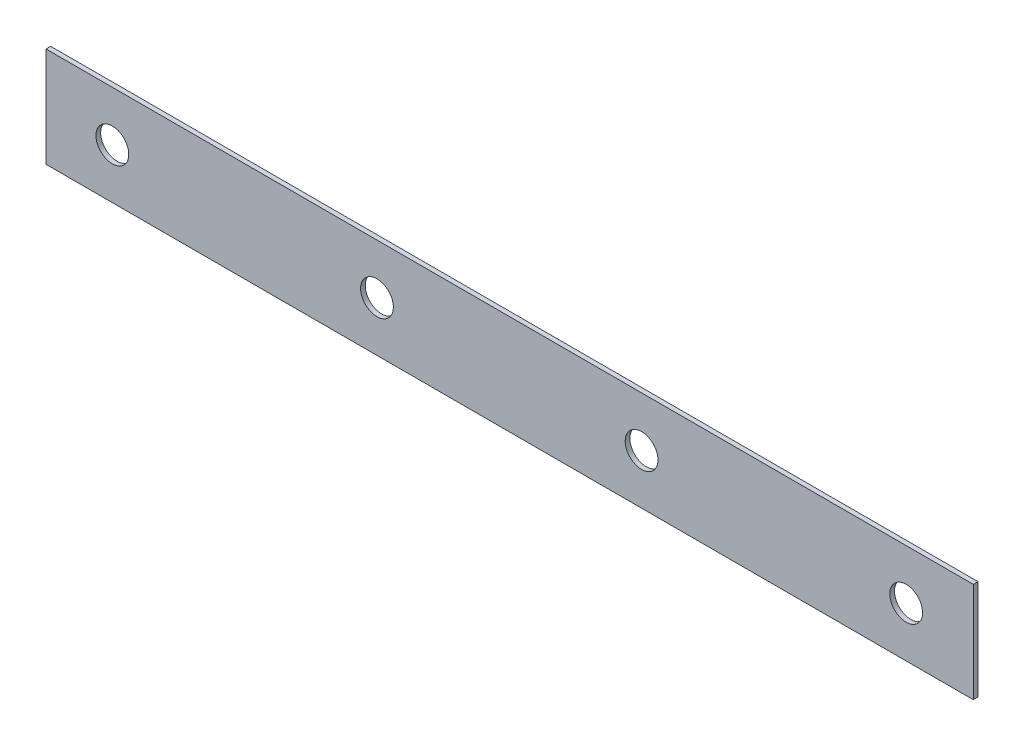
ISO-10303-21;
HEADER;
FILE_DESCRIPTION(('STEP AP214'),'2;1');
FILE_NAME('part.step','',(''),(''),'','','');
FILE_SCHEMA(('AUTOMOTIVE_DESIGN { 1 0 10303 214 1 1 1 1 }'));
ENDSEC;
DATA;
#1=APPLICATION_CONTEXT('core data for automotive mechanical design processes');
#2=APPLICATION_PROTOCOL_DEFINITION('international standard','automotive_design',2000,#1);
#3=PRODUCT_CONTEXT('',#1,'mechanical');
#4=PRODUCT('Part','Part','',(#3));
#5=PRODUCT_RELATED_PRODUCT_CATEGORY('part','',(#4));
#6=PRODUCT_DEFINITION_FORMATION('','',#4);
#7=PRODUCT_DEFINITION_CONTEXT('part definition',#1,'design');
#8=PRODUCT_DEFINITION('design','',#6,#7);
#9=PRODUCT_DEFINITION_SHAPE('','',#8);
#10=(LENGTH_UNIT() NAMED_UNIT(*) SI_UNIT(.MILLI.,.METRE.));
#11=(NAMED_UNIT(*) PLANE_ANGLE_UNIT() SI_UNIT($,.RADIAN.));
#12=(NAMED_UNIT(*) SI_UNIT($,.STERADIAN.) SOLID_ANGLE_UNIT());
#13=UNCERTAINTY_MEASURE_WITH_UNIT(LENGTH_MEASURE(1.E-05),#10,'distance_accuracy_value','');
#14=(GEOMETRIC_REPRESENTATION_CONTEXT(3) GLOBAL_UNCERTAINTY_ASSIGNED_CONTEXT((#13)) GLOBAL_UNIT_ASSIGNED_CONTEXT((#10,
#11,#12)) REPRESENTATION_CONTEXT('',''));
#15=CARTESIAN_POINT('',(0.,0.,0.));
#16=DIRECTION('',(0.,0.,1.));
#17=DIRECTION('',(1.,0.,0.));
#18=AXIS2_PLACEMENT_3D('',#15,#16,#17);
#19=CARTESIAN_POINT('',(0.,0.,3.));
#20=DIRECTION('',(0.,0.,-1.));
#21=DIRECTION('',(-1.,0.,0.));
#22=AXIS2_PLACEMENT_3D('',#19,#20,#21);
#23=PLANE('',#22);
#24=DIRECTION('',(0.,-1.,0.));
#25=VECTOR('',#24,1.);
#26=CARTESIAN_POINT('',(0.,63.9999999999999,3.));
#27=LINE('',#26,#25);
#28=CARTESIAN_POINT('',(0.,63.9999999999999,3.));
#29=VERTEX_POINT('',#28);
#30=CARTESIAN_POINT('',(0.,0.,3.));
#31=VERTEX_POINT('',#30);
#32=EDGE_CURVE('E92',#29,#31,#27,.T.);
#33=ORIENTED_EDGE('',*,*,#32,.T.);
#34=DIRECTION('',(1.,0.,0.));
#35=VECTOR('',#34,1.);
#36=CARTESIAN_POINT('',(594.,0.,3.));
#37=LINE('',#36,#35);
#38=CARTESIAN_POINT('',(594.,0.,3.));
#39=VERTEX_POINT('',#38);
#40=EDGE_CURVE('E87',#31,#39,#37,.T.);
#41=ORIENTED_EDGE('',*,*,#40,.T.);
#42=DIRECTION('',(0.,1.,0.));
#43=VECTOR('',#42,1.);
#44=CARTESIAN_POINT('',(594.,64.,3.));
#45=LINE('',#44,#43);
#46=CARTESIAN_POINT('',(594.,64.,3.));
#47=VERTEX_POINT('',#46);
#48=EDGE_CURVE('E90',#39,#47,#45,.T.);
#49=ORIENTED_EDGE('',*,*,#48,.T.);
#50=DIRECTION('',(-1.,0.,0.));
#51=VECTOR('',#50,1.);
#52=CARTESIAN_POINT('',(594.,64.,3.));
#53=LINE('',#52,#51);
#54=EDGE_CURVE('E57',#47,#29,#53,.T.);
#55=ORIENTED_EDGE('',*,*,#54,.T.);
#56=EDGE_LOOP('',(#33,#41,#49,#55));
#57=FACE_BOUND('',#56,.T.);
#58=CARTESIAN_POINT('',(42.5,31.9999999999999,3.));
#59=DIRECTION('',(0.,0.,1.));
#60=DIRECTION('',(1.,0.,0.));
#61=AXIS2_PLACEMENT_3D('',#58,#59,#60);
#62=CIRCLE('',#61,10.5);
#63=CARTESIAN_POINT('',(53.,31.9999999999999,3.));
#64=VERTEX_POINT('',#63);
#65=EDGE_CURVE('E112',#64,#64,#62,.T.);
#66=ORIENTED_EDGE('',*,*,#65,.F.);
#67=EDGE_LOOP('',(#66));
#68=FACE_BOUND('',#67,.T.);
#69=CARTESIAN_POINT('',(212.,32.,3.));
#70=DIRECTION('',(0.,0.,1.));
#71=DIRECTION('',(1.,0.,0.));
#72=AXIS2_PLACEMENT_3D('',#69,#70,#71);
#73=CIRCLE('',#72,10.5);
#74=CARTESIAN_POINT('',(222.5,32.,3.));
#75=VERTEX_POINT('',#74);
#76=EDGE_CURVE('E134',#75,#75,#73,.T.);
#77=ORIENTED_EDGE('',*,*,#76,.F.);
#78=EDGE_LOOP('',(#77));
#79=FACE_BOUND('',#78,.T.);
#80=CARTESIAN_POINT('',(381.5,32.,3.));
#81=DIRECTION('',(0.,0.,1.));
#82=DIRECTION('',(-1.,0.,0.));
#83=AXIS2_PLACEMENT_3D('',#80,#81,#82);
#84=CIRCLE('',#83,10.5);
#85=CARTESIAN_POINT('',(371.,32.,3.));
#86=VERTEX_POINT('',#85);
#87=EDGE_CURVE('E142',#86,#86,#84,.T.);
#88=ORIENTED_EDGE('',*,*,#87,.F.);
#89=EDGE_LOOP('',(#88));
#90=FACE_BOUND('',#89,.T.);
#91=CARTESIAN_POINT('',(551.,32.,3.));
#92=DIRECTION('',(0.,0.,1.));
#93=DIRECTION('',(-1.,0.,0.));
#94=AXIS2_PLACEMENT_3D('',#91,#92,#93);
#95=CIRCLE('',#94,10.5);
#96=CARTESIAN_POINT('',(540.5,32.,3.));
#97=VERTEX_POINT('',#96);
#98=EDGE_CURVE('E150',#97,#97,#95,.T.);
#99=ORIENTED_EDGE('',*,*,#98,.F.);
#100=EDGE_LOOP('',(#99));
#101=FACE_BOUND('',#100,.T.);
#102=ADVANCED_FACE('F39',(#57,#68,#79,#90,#101),#23,.F.);
#103=CARTESIAN_POINT('',(0.,0.,0.));
#104=DIRECTION('',(0.,0.,-1.));
#105=DIRECTION('',(-1.,0.,0.));
#106=AXIS2_PLACEMENT_3D('',#103,#104,#105);
#107=PLANE('',#106);
#108=CARTESIAN_POINT('',(381.5,32.,0.));
#109=DIRECTION('',(0.,0.,1.));
#110=DIRECTION('',(-1.,0.,0.));
#111=AXIS2_PLACEMENT_3D('',#108,#109,#110);
#112=CIRCLE('',#111,10.5);
#113=CARTESIAN_POINT('',(371.,32.,0.));
#114=VERTEX_POINT('',#113);
#115=EDGE_CURVE('E146',#114,#114,#112,.T.);
#116=ORIENTED_EDGE('',*,*,#115,.T.);
#117=EDGE_LOOP('',(#116));
#118=FACE_BOUND('',#117,.T.);
#119=CARTESIAN_POINT('',(42.5,31.9999999999999,0.));
#120=DIRECTION('',(0.,0.,1.));
#121=DIRECTION('',(1.,0.,0.));
#122=AXIS2_PLACEMENT_3D('',#119,#120,#121);
#123=CIRCLE('',#122,10.5);
#124=CARTESIAN_POINT('',(53.,31.9999999999999,0.));
#125=VERTEX_POINT('',#124);
#126=EDGE_CURVE('E130',#125,#125,#123,.T.);
#127=ORIENTED_EDGE('',*,*,#126,.T.);
#128=EDGE_LOOP('',(#127));
#129=FACE_BOUND('',#128,.T.);
#130=DIRECTION('',(0.,-1.,0.));
#131=VECTOR('',#130,1.);
#132=CARTESIAN_POINT('',(0.,63.9999999999999,0.));
#133=LINE('',#132,#131);
#134=CARTESIAN_POINT('',(0.,63.9999999999999,0.));
#135=VERTEX_POINT('',#134);
#136=CARTESIAN_POINT('',(0.,0.,0.));
#137=VERTEX_POINT('',#136);
#138=EDGE_CURVE('E108',#135,#137,#133,.T.);
#139=ORIENTED_EDGE('',*,*,#138,.F.);
#140=DIRECTION('',(-1.,0.,0.));
#141=VECTOR('',#140,1.);
#142=CARTESIAN_POINT('',(594.,64.,0.));
#143=LINE('',#142,#141);
#144=CARTESIAN_POINT('',(594.,64.,0.));
#145=VERTEX_POINT('',#144);
#146=EDGE_CURVE('E80',#145,#135,#143,.T.);
#147=ORIENTED_EDGE('',*,*,#146,.F.);
#148=DIRECTION('',(0.,1.,0.));
#149=VECTOR('',#148,1.);
#150=CARTESIAN_POINT('',(594.,64.,0.));
#151=LINE('',#150,#149);
#152=CARTESIAN_POINT('',(594.,0.,0.));
#153=VERTEX_POINT('',#152);
#154=EDGE_CURVE('E74',#153,#145,#151,.T.);
#155=ORIENTED_EDGE('',*,*,#154,.F.);
#156=DIRECTION('',(1.,0.,0.));
#157=VECTOR('',#156,1.);
#158=CARTESIAN_POINT('',(594.,0.,0.));
#159=LINE('',#158,#157);
#160=EDGE_CURVE('E97',#137,#153,#159,.T.);
#161=ORIENTED_EDGE('',*,*,#160,.F.);
#162=EDGE_LOOP('',(#139,#147,#155,#161));
#163=FACE_BOUND('',#162,.T.);
#164=CARTESIAN_POINT('',(212.,32.,0.));
#165=DIRECTION('',(0.,0.,1.));
#166=DIRECTION('',(1.,0.,0.));
#167=AXIS2_PLACEMENT_3D('',#164,#165,#166);
#168=CIRCLE('',#167,10.5);
#169=CARTESIAN_POINT('',(222.5,32.,0.));
#170=VERTEX_POINT('',#169);
#171=EDGE_CURVE('E138',#170,#170,#168,.T.);
#172=ORIENTED_EDGE('',*,*,#171,.T.);
#173=EDGE_LOOP('',(#172));
#174=FACE_BOUND('',#173,.T.);
#175=CARTESIAN_POINT('',(551.,32.,0.));
#176=DIRECTION('',(0.,0.,1.));
#177=DIRECTION('',(-1.,0.,0.));
#178=AXIS2_PLACEMENT_3D('',#175,#176,#177);
#179=CIRCLE('',#178,10.5);
#180=CARTESIAN_POINT('',(540.5,32.,0.));
#181=VERTEX_POINT('',#180);
#182=EDGE_CURVE('E154',#181,#181,#179,.T.);
#183=ORIENTED_EDGE('',*,*,#182,.T.);
#184=EDGE_LOOP('',(#183));
#185=FACE_BOUND('',#184,.T.);
#186=ADVANCED_FACE('F125',(#118,#129,#163,#174,#185),#107,.T.);
#187=CARTESIAN_POINT('',(0.,63.9999999999999,3.));
#188=DIRECTION('',(1.,0.,0.));
#189=DIRECTION('',(0.,1.,0.));
#190=AXIS2_PLACEMENT_3D('',#187,#188,#189);
#191=PLANE('',#190);
#192=ORIENTED_EDGE('',*,*,#138,.T.);
#193=DIRECTION('',(0.,0.,-1.));
#194=VECTOR('',#193,1.);
#195=CARTESIAN_POINT('',(0.,0.,3.));
#196=LINE('',#195,#194);
#197=EDGE_CURVE('E11',#31,#137,#196,.T.);
#198=ORIENTED_EDGE('',*,*,#197,.F.);
#199=ORIENTED_EDGE('',*,*,#32,.F.);
#200=DIRECTION('',(0.,0.,-1.));
#201=VECTOR('',#200,1.);
#202=CARTESIAN_POINT('',(0.,63.9999999999999,3.));
#203=LINE('',#202,#201);
#204=EDGE_CURVE('E104',#29,#135,#203,.T.);
#205=ORIENTED_EDGE('',*,*,#204,.T.);
#206=EDGE_LOOP('',(#192,#198,#199,#205));
#207=FACE_BOUND('',#206,.T.);
#208=ADVANCED_FACE('F41',(#207),#191,.F.);
#209=CARTESIAN_POINT('',(594.,0.,3.));
#210=DIRECTION('',(0.,1.,0.));
#211=DIRECTION('',(-1.,0.,0.));
#212=AXIS2_PLACEMENT_3D('',#209,#210,#211);
#213=PLANE('',#212);
#214=ORIENTED_EDGE('',*,*,#160,.T.);
#215=DIRECTION('',(0.,0.,-1.));
#216=VECTOR('',#215,1.);
#217=CARTESIAN_POINT('',(594.,0.,3.));
#218=LINE('',#217,#216);
#219=EDGE_CURVE('E49',#39,#153,#218,.T.);
#220=ORIENTED_EDGE('',*,*,#219,.F.);
#221=ORIENTED_EDGE('',*,*,#40,.F.);
#222=ORIENTED_EDGE('',*,*,#197,.T.);
#223=EDGE_LOOP('',(#214,#220,#221,#222));
#224=FACE_BOUND('',#223,.T.);
#225=ADVANCED_FACE('F96',(#224),#213,.F.);
#226=CARTESIAN_POINT('',(594.,64.,3.));
#227=DIRECTION('',(-1.,0.,0.));
#228=DIRECTION('',(0.,0.,1.));
#229=AXIS2_PLACEMENT_3D('',#226,#227,#228);
#230=PLANE('',#229);
#231=ORIENTED_EDGE('',*,*,#154,.T.);
#232=DIRECTION('',(0.,0.,-1.));
#233=VECTOR('',#232,1.);
#234=CARTESIAN_POINT('',(594.,64.,3.));
#235=LINE('',#234,#233);
#236=EDGE_CURVE('E99',#47,#145,#235,.T.);
#237=ORIENTED_EDGE('',*,*,#236,.F.);
#238=ORIENTED_EDGE('',*,*,#48,.F.);
#239=ORIENTED_EDGE('',*,*,#219,.T.);
#240=EDGE_LOOP('',(#231,#237,#238,#239));
#241=FACE_BOUND('',#240,.T.);
#242=ADVANCED_FACE('F100',(#241),#230,.F.);
#243=CARTESIAN_POINT('',(594.,64.,3.));
#244=DIRECTION('',(0.,-1.,0.));
#245=DIRECTION('',(1.,0.,0.));
#246=AXIS2_PLACEMENT_3D('',#243,#244,#245);
#247=PLANE('',#246);
#248=ORIENTED_EDGE('',*,*,#146,.T.);
#249=ORIENTED_EDGE('',*,*,#204,.F.);
#250=ORIENTED_EDGE('',*,*,#54,.F.);
#251=ORIENTED_EDGE('',*,*,#236,.T.);
#252=EDGE_LOOP('',(#248,#249,#250,#251));
#253=FACE_BOUND('',#252,.T.);
#254=ADVANCED_FACE('F122',(#253),#247,.F.);
#255=CARTESIAN_POINT('',(42.5,31.9999999999999,3.));
#256=DIRECTION('',(0.,0.,-1.));
#257=DIRECTION('',(-1.,0.,0.));
#258=AXIS2_PLACEMENT_3D('',#255,#256,#257);
#259=CYLINDRICAL_SURFACE('',#258,10.5);
#260=ORIENTED_EDGE('',*,*,#65,.T.);
#261=EDGE_LOOP('',(#260));
#262=FACE_BOUND('',#261,.T.);
#263=ORIENTED_EDGE('',*,*,#126,.F.);
#264=EDGE_LOOP('',(#263));
#265=FACE_BOUND('',#264,.T.);
#266=ADVANCED_FACE('F173',(#262,#265),#259,.F.);
#267=CARTESIAN_POINT('',(212.,32.,3.));
#268=DIRECTION('',(0.,0.,-1.));
#269=DIRECTION('',(-1.,0.,0.));
#270=AXIS2_PLACEMENT_3D('',#267,#268,#269);
#271=CYLINDRICAL_SURFACE('',#270,10.5);
#272=ORIENTED_EDGE('',*,*,#76,.T.);
#273=EDGE_LOOP('',(#272));
#274=FACE_BOUND('',#273,.T.);
#275=ORIENTED_EDGE('',*,*,#171,.F.);
#276=EDGE_LOOP('',(#275));
#277=FACE_BOUND('',#276,.T.);
#278=ADVANCED_FACE('F219',(#274,#277),#271,.F.);
#279=CARTESIAN_POINT('',(381.5,32.,3.));
#280=DIRECTION('',(0.,0.,-1.));
#281=DIRECTION('',(-1.,0.,0.));
#282=AXIS2_PLACEMENT_3D('',#279,#280,#281);
#283=CYLINDRICAL_SURFACE('',#282,10.5);
#284=ORIENTED_EDGE('',*,*,#87,.T.);
#285=EDGE_LOOP('',(#284));
#286=FACE_BOUND('',#285,.T.);
#287=ORIENTED_EDGE('',*,*,#115,.F.);
#288=EDGE_LOOP('',(#287));
#289=FACE_BOUND('',#288,.T.);
#290=ADVANCED_FACE('F227',(#286,#289),#283,.F.);
#291=CARTESIAN_POINT('',(551.,32.,3.));
#292=DIRECTION('',(0.,0.,-1.));
#293=DIRECTION('',(-1.,0.,0.));
#294=AXIS2_PLACEMENT_3D('',#291,#292,#293);
#295=CYLINDRICAL_SURFACE('',#294,10.5);
#296=ORIENTED_EDGE('',*,*,#98,.T.);
#297=EDGE_LOOP('',(#296));
#298=FACE_BOUND('',#297,.T.);
#299=ORIENTED_EDGE('',*,*,#182,.F.);
#300=EDGE_LOOP('',(#299));
#301=FACE_BOUND('',#300,.T.);
#302=ADVANCED_FACE('F162',(#298,#301),#295,.F.);
#303=CLOSED_SHELL('',(#102,#186,#208,#225,#242,#254,#266,#278,#290,#302));
#304=MANIFOLD_SOLID_BREP('B2',#303);
#305=ADVANCED_BREP_SHAPE_REPRESENTATION('',(#18,#304),#14);
#306=SHAPE_DEFINITION_REPRESENTATION(#9,#305);
ENDSEC;
END-ISO-10303-21;
